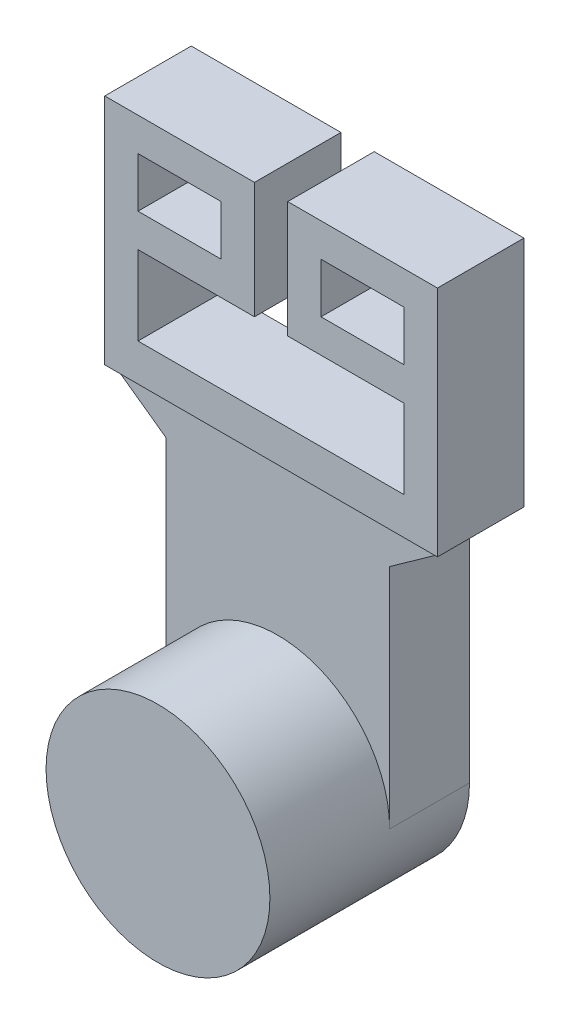
ISO-10303-21;
HEADER;
FILE_DESCRIPTION(('STEP AP214'),'2;1');
FILE_NAME('part.step','',(''),(''),'','','');
FILE_SCHEMA(('AUTOMOTIVE_DESIGN { 1 0 10303 214 1 1 1 1 }'));
ENDSEC;
DATA;
#1=APPLICATION_CONTEXT('core data for automotive mechanical design processes');
#2=APPLICATION_PROTOCOL_DEFINITION('international standard','automotive_design',2000,#1);
#3=PRODUCT_CONTEXT('',#1,'mechanical');
#4=PRODUCT('Part','Part','',(#3));
#5=PRODUCT_RELATED_PRODUCT_CATEGORY('part','',(#4));
#6=PRODUCT_DEFINITION_FORMATION('','',#4);
#7=PRODUCT_DEFINITION_CONTEXT('part definition',#1,'design');
#8=PRODUCT_DEFINITION('design','',#6,#7);
#9=PRODUCT_DEFINITION_SHAPE('','',#8);
#10=(LENGTH_UNIT() NAMED_UNIT(*) SI_UNIT(.MILLI.,.METRE.));
#11=(NAMED_UNIT(*) PLANE_ANGLE_UNIT() SI_UNIT($,.RADIAN.));
#12=(NAMED_UNIT(*) SI_UNIT($,.STERADIAN.) SOLID_ANGLE_UNIT());
#13=UNCERTAINTY_MEASURE_WITH_UNIT(LENGTH_MEASURE(1.E-05),#10,'distance_accuracy_value','');
#14=(GEOMETRIC_REPRESENTATION_CONTEXT(3) GLOBAL_UNCERTAINTY_ASSIGNED_CONTEXT((#13)) GLOBAL_UNIT_ASSIGNED_CONTEXT((#10,
#11,#12)) REPRESENTATION_CONTEXT('',''));
#15=CARTESIAN_POINT('',(0.,0.,0.));
#16=DIRECTION('',(0.,0.,1.));
#17=DIRECTION('',(1.,0.,0.));
#18=AXIS2_PLACEMENT_3D('',#15,#16,#17);
#19=CARTESIAN_POINT('',(0.,25.4,0.));
#20=DIRECTION('',(0.,1.,0.));
#21=DIRECTION('',(0.,0.,1.));
#22=AXIS2_PLACEMENT_3D('',#19,#20,#21);
#23=PLANE('',#22);
#24=DIRECTION('',(1.,0.,0.));
#25=VECTOR('',#24,1.);
#26=CARTESIAN_POINT('',(10.6807,25.4,7.62));
#27=LINE('',#26,#25);
#28=CARTESIAN_POINT('',(-15.875,25.4,7.62));
#29=VERTEX_POINT('',#28);
#30=CARTESIAN_POINT('',(15.875,25.4,7.62));
#31=VERTEX_POINT('',#30);
#32=EDGE_CURVE('E392',#29,#31,#27,.T.);
#33=ORIENTED_EDGE('',*,*,#32,.T.);
#34=DIRECTION('',(0.,0.,-1.));
#35=VECTOR('',#34,1.);
#36=CARTESIAN_POINT('',(15.875,25.4,0.));
#37=LINE('',#36,#35);
#38=CARTESIAN_POINT('',(15.875,25.4,8.255));
#39=VERTEX_POINT('',#38);
#40=EDGE_CURVE('E372',#39,#31,#37,.T.);
#41=ORIENTED_EDGE('',*,*,#40,.F.);
#42=DIRECTION('',(1.,0.,0.));
#43=VECTOR('',#42,1.);
#44=CARTESIAN_POINT('',(-15.875,25.4,8.255));
#45=LINE('',#44,#43);
#46=CARTESIAN_POINT('',(-15.875,25.4,8.255));
#47=VERTEX_POINT('',#46);
#48=EDGE_CURVE('E303',#47,#39,#45,.T.);
#49=ORIENTED_EDGE('',*,*,#48,.F.);
#50=DIRECTION('',(0.,0.,1.));
#51=VECTOR('',#50,1.);
#52=CARTESIAN_POINT('',(-15.875,25.4,15.875));
#53=LINE('',#52,#51);
#54=EDGE_CURVE('E358',#29,#47,#53,.T.);
#55=ORIENTED_EDGE('',*,*,#54,.F.);
#56=EDGE_LOOP('',(#33,#41,#49,#55));
#57=FACE_BOUND('',#56,.T.);
#58=ADVANCED_FACE('F45',(#57),#23,.F.);
#59=CARTESIAN_POINT('',(12.7,0.,0.));
#60=DIRECTION('',(1.,0.,0.));
#61=DIRECTION('',(0.,0.,-1.));
#62=AXIS2_PLACEMENT_3D('',#59,#60,#61);
#63=PLANE('',#62);
#64=DIRECTION('',(0.,0.,-1.));
#65=VECTOR('',#64,1.);
#66=CARTESIAN_POINT('',(12.7,28.956,0.));
#67=LINE('',#66,#65);
#68=CARTESIAN_POINT('',(12.7,28.956,8.255));
#69=VERTEX_POINT('',#68);
#70=CARTESIAN_POINT('',(12.7,28.956,0.));
#71=VERTEX_POINT('',#70);
#72=EDGE_CURVE('E386',#69,#71,#67,.T.);
#73=ORIENTED_EDGE('',*,*,#72,.F.);
#74=DIRECTION('',(0.,1.,0.));
#75=VECTOR('',#74,1.);
#76=CARTESIAN_POINT('',(12.7,0.,8.255));
#77=LINE('',#76,#75);
#78=CARTESIAN_POINT('',(12.7,36.5125,8.255));
#79=VERTEX_POINT('',#78);
#80=EDGE_CURVE('E313',#69,#79,#77,.T.);
#81=ORIENTED_EDGE('',*,*,#80,.T.);
#82=DIRECTION('',(0.,0.,1.));
#83=VECTOR('',#82,1.);
#84=CARTESIAN_POINT('',(12.7,36.5125,15.875));
#85=LINE('',#84,#83);
#86=CARTESIAN_POINT('',(12.7,36.5125,0.));
#87=VERTEX_POINT('',#86);
#88=EDGE_CURVE('E326',#87,#79,#85,.T.);
#89=ORIENTED_EDGE('',*,*,#88,.F.);
#90=DIRECTION('',(0.,1.,0.));
#91=VECTOR('',#90,1.);
#92=CARTESIAN_POINT('',(12.7,25.4,0.));
#93=LINE('',#92,#91);
#94=EDGE_CURVE('E365',#71,#87,#93,.T.);
#95=ORIENTED_EDGE('',*,*,#94,.F.);
#96=EDGE_LOOP('',(#73,#81,#89,#95));
#97=FACE_BOUND('',#96,.T.);
#98=ADVANCED_FACE('F467',(#97),#63,.F.);
#99=CARTESIAN_POINT('',(-12.7,0.,0.));
#100=DIRECTION('',(-1.,0.,0.));
#101=DIRECTION('',(0.,0.,1.));
#102=AXIS2_PLACEMENT_3D('',#99,#100,#101);
#103=PLANE('',#102);
#104=DIRECTION('',(0.,0.,-1.));
#105=VECTOR('',#104,1.);
#106=CARTESIAN_POINT('',(-12.7,36.5125,15.875));
#107=LINE('',#106,#105);
#108=CARTESIAN_POINT('',(-12.7,36.5125,8.255));
#109=VERTEX_POINT('',#108);
#110=CARTESIAN_POINT('',(-12.7,36.5125,0.));
#111=VERTEX_POINT('',#110);
#112=EDGE_CURVE('E339',#109,#111,#107,.T.);
#113=ORIENTED_EDGE('',*,*,#112,.F.);
#114=DIRECTION('',(0.,-1.,0.));
#115=VECTOR('',#114,1.);
#116=CARTESIAN_POINT('',(-12.7,0.,8.255));
#117=LINE('',#116,#115);
#118=CARTESIAN_POINT('',(-12.7,28.956,8.255));
#119=VERTEX_POINT('',#118);
#120=EDGE_CURVE('E318',#109,#119,#117,.T.);
#121=ORIENTED_EDGE('',*,*,#120,.T.);
#122=DIRECTION('',(0.,0.,1.));
#123=VECTOR('',#122,1.);
#124=CARTESIAN_POINT('',(-12.7,28.956,0.));
#125=LINE('',#124,#123);
#126=CARTESIAN_POINT('',(-12.7,28.956,0.));
#127=VERTEX_POINT('',#126);
#128=EDGE_CURVE('E383',#127,#119,#125,.T.);
#129=ORIENTED_EDGE('',*,*,#128,.F.);
#130=DIRECTION('',(0.,-1.,0.));
#131=VECTOR('',#130,1.);
#132=CARTESIAN_POINT('',(-12.7,25.4,0.));
#133=LINE('',#132,#131);
#134=EDGE_CURVE('E352',#111,#127,#133,.T.);
#135=ORIENTED_EDGE('',*,*,#134,.F.);
#136=EDGE_LOOP('',(#113,#121,#129,#135));
#137=FACE_BOUND('',#136,.T.);
#138=ADVANCED_FACE('F476',(#137),#103,.F.);
#139=CARTESIAN_POINT('',(0.,0.,19.05));
#140=DIRECTION('',(0.,0.,-1.));
#141=DIRECTION('',(-1.,0.,0.));
#142=AXIS2_PLACEMENT_3D('',#139,#140,#141);
#143=CYLINDRICAL_SURFACE('',#142,10.6807);
#144=CARTESIAN_POINT('',(0.,0.,7.62));
#145=DIRECTION('',(0.,0.,1.));
#146=DIRECTION('',(1.,0.,0.));
#147=AXIS2_PLACEMENT_3D('',#144,#145,#146);
#148=CIRCLE('',#147,10.6807);
#149=CARTESIAN_POINT('',(10.6807,0.,7.62));
#150=VERTEX_POINT('',#149);
#151=CARTESIAN_POINT('',(-10.6807,0.,7.62));
#152=VERTEX_POINT('',#151);
#153=EDGE_CURVE('E53',#150,#152,#148,.T.);
#154=ORIENTED_EDGE('',*,*,#153,.T.);
#155=DIRECTION('',(0.,0.,-1.));
#156=VECTOR('',#155,1.);
#157=CARTESIAN_POINT('',(-10.6807,0.,7.62));
#158=LINE('',#157,#156);
#159=CARTESIAN_POINT('',(-10.6807,0.,0.));
#160=VERTEX_POINT('',#159);
#161=EDGE_CURVE('E401',#152,#160,#158,.T.);
#162=ORIENTED_EDGE('',*,*,#161,.T.);
#163=CARTESIAN_POINT('',(0.,0.,0.));
#164=DIRECTION('',(0.,0.,1.));
#165=DIRECTION('',(1.,0.,0.));
#166=AXIS2_PLACEMENT_3D('',#163,#164,#165);
#167=CIRCLE('',#166,10.6807);
#168=CARTESIAN_POINT('',(10.6807,0.,0.));
#169=VERTEX_POINT('',#168);
#170=EDGE_CURVE('E404',#160,#169,#167,.T.);
#171=ORIENTED_EDGE('',*,*,#170,.T.);
#172=DIRECTION('',(0.,0.,-1.));
#173=VECTOR('',#172,1.);
#174=CARTESIAN_POINT('',(10.6807,0.,7.62));
#175=LINE('',#174,#173);
#176=EDGE_CURVE('E397',#150,#169,#175,.T.);
#177=ORIENTED_EDGE('',*,*,#176,.F.);
#178=EDGE_LOOP('',(#154,#162,#171,#177));
#179=FACE_BOUND('',#178,.T.);
#180=CARTESIAN_POINT('',(0.,0.,19.05));
#181=DIRECTION('',(0.,0.,1.));
#182=DIRECTION('',(1.,0.,0.));
#183=AXIS2_PLACEMENT_3D('',#180,#181,#182);
#184=CIRCLE('',#183,10.6807);
#185=CARTESIAN_POINT('',(10.6807,0.,19.05));
#186=VERTEX_POINT('',#185);
#187=EDGE_CURVE('E407',#186,#186,#184,.T.);
#188=ORIENTED_EDGE('',*,*,#187,.F.);
#189=EDGE_LOOP('',(#188));
#190=FACE_BOUND('',#189,.T.);
#191=ADVANCED_FACE('F47',(#179,#190),#143,.T.);
#192=CARTESIAN_POINT('',(0.,0.,19.05));
#193=DIRECTION('',(0.,0.,1.));
#194=DIRECTION('',(1.,0.,0.));
#195=AXIS2_PLACEMENT_3D('',#192,#193,#194);
#196=PLANE('',#195);
#197=ORIENTED_EDGE('',*,*,#187,.T.);
#198=EDGE_LOOP('',(#197));
#199=FACE_BOUND('',#198,.T.);
#200=ADVANCED_FACE('F515',(#199),#196,.T.);
#201=CARTESIAN_POINT('',(0.,0.,0.));
#202=DIRECTION('',(0.,0.,1.));
#203=DIRECTION('',(1.,0.,0.));
#204=AXIS2_PLACEMENT_3D('',#201,#202,#203);
#205=PLANE('',#204);
#206=DIRECTION('',(-1.,0.,0.));
#207=VECTOR('',#206,1.);
#208=CARTESIAN_POINT('',(12.7,39.6875,0.));
#209=LINE('',#208,#207);
#210=CARTESIAN_POINT('',(12.7,39.6875,0.));
#211=VERTEX_POINT('',#210);
#212=CARTESIAN_POINT('',(4.7625,39.6875,0.));
#213=VERTEX_POINT('',#212);
#214=EDGE_CURVE('E235',#211,#213,#209,.T.);
#215=ORIENTED_EDGE('',*,*,#214,.F.);
#216=DIRECTION('',(0.,-1.,0.));
#217=VECTOR('',#216,1.);
#218=CARTESIAN_POINT('',(12.7,39.6875,0.));
#219=LINE('',#218,#217);
#220=CARTESIAN_POINT('',(12.7,44.45,0.));
#221=VERTEX_POINT('',#220);
#222=EDGE_CURVE('E215',#221,#211,#219,.T.);
#223=ORIENTED_EDGE('',*,*,#222,.F.);
#224=DIRECTION('',(1.,0.,0.));
#225=VECTOR('',#224,1.);
#226=CARTESIAN_POINT('',(12.7,44.45,0.));
#227=LINE('',#226,#225);
#228=CARTESIAN_POINT('',(4.7625,44.45,0.));
#229=VERTEX_POINT('',#228);
#230=EDGE_CURVE('E226',#229,#221,#227,.T.);
#231=ORIENTED_EDGE('',*,*,#230,.F.);
#232=DIRECTION('',(0.,1.,0.));
#233=VECTOR('',#232,1.);
#234=CARTESIAN_POINT('',(4.7625,39.6875,0.));
#235=LINE('',#234,#233);
#236=EDGE_CURVE('E60',#213,#229,#235,.T.);
#237=ORIENTED_EDGE('',*,*,#236,.F.);
#238=EDGE_LOOP('',(#215,#223,#231,#237));
#239=FACE_BOUND('',#238,.T.);
#240=DIRECTION('',(1.,0.,0.));
#241=VECTOR('',#240,1.);
#242=CARTESIAN_POINT('',(-12.7,44.45,0.));
#243=LINE('',#242,#241);
#244=CARTESIAN_POINT('',(-12.7,44.45,0.));
#245=VERTEX_POINT('',#244);
#246=CARTESIAN_POINT('',(-4.7625,44.45,0.));
#247=VERTEX_POINT('',#246);
#248=EDGE_CURVE('E278',#245,#247,#243,.T.);
#249=ORIENTED_EDGE('',*,*,#248,.F.);
#250=DIRECTION('',(0.,1.,0.));
#251=VECTOR('',#250,1.);
#252=CARTESIAN_POINT('',(-12.7,39.6875,0.));
#253=LINE('',#252,#251);
#254=CARTESIAN_POINT('',(-12.7,39.6875,0.));
#255=VERTEX_POINT('',#254);
#256=EDGE_CURVE('E275',#255,#245,#253,.T.);
#257=ORIENTED_EDGE('',*,*,#256,.F.);
#258=DIRECTION('',(-1.,0.,0.));
#259=VECTOR('',#258,1.);
#260=CARTESIAN_POINT('',(-12.7,39.6875,0.));
#261=LINE('',#260,#259);
#262=CARTESIAN_POINT('',(-4.7625,39.6875,0.));
#263=VERTEX_POINT('',#262);
#264=EDGE_CURVE('E252',#263,#255,#261,.T.);
#265=ORIENTED_EDGE('',*,*,#264,.F.);
#266=DIRECTION('',(0.,-1.,0.));
#267=VECTOR('',#266,1.);
#268=CARTESIAN_POINT('',(-4.7625,39.6875,0.));
#269=LINE('',#268,#267);
#270=EDGE_CURVE('E68',#247,#263,#269,.T.);
#271=ORIENTED_EDGE('',*,*,#270,.F.);
#272=EDGE_LOOP('',(#249,#257,#265,#271));
#273=FACE_BOUND('',#272,.T.);
#274=DIRECTION('',(0.,1.,0.));
#275=VECTOR('',#274,1.);
#276=CARTESIAN_POINT('',(-10.6807,0.,0.));
#277=LINE('',#276,#275);
#278=CARTESIAN_POINT('',(-10.6807,21.684330035644,0.));
#279=VERTEX_POINT('',#278);
#280=EDGE_CURVE('E388',#160,#279,#277,.T.);
#281=ORIENTED_EDGE('',*,*,#280,.T.);
#282=DIRECTION('',(-0.81332923451212,0.581803709414034,0.));
#283=VECTOR('',#282,1.);
#284=CARTESIAN_POINT('',(-15.875,25.4,0.));
#285=LINE('',#284,#283);
#286=CARTESIAN_POINT('',(-15.875,25.4,0.));
#287=VERTEX_POINT('',#286);
#288=EDGE_CURVE('E288',#279,#287,#285,.T.);
#289=ORIENTED_EDGE('',*,*,#288,.T.);
#290=DIRECTION('',(0.,-1.,0.));
#291=VECTOR('',#290,1.);
#292=CARTESIAN_POINT('',(-15.875,25.4,0.));
#293=LINE('',#292,#291);
#294=CARTESIAN_POINT('',(-15.875,47.625,0.));
#295=VERTEX_POINT('',#294);
#296=EDGE_CURVE('E355',#295,#287,#293,.T.);
#297=ORIENTED_EDGE('',*,*,#296,.F.);
#298=DIRECTION('',(1.,0.,0.));
#299=VECTOR('',#298,1.);
#300=CARTESIAN_POINT('',(-15.875,47.625,0.));
#301=LINE('',#300,#299);
#302=CARTESIAN_POINT('',(-1.5875,47.625,0.));
#303=VERTEX_POINT('',#302);
#304=EDGE_CURVE('E362',#295,#303,#301,.T.);
#305=ORIENTED_EDGE('',*,*,#304,.T.);
#306=DIRECTION('',(0.,1.,0.));
#307=VECTOR('',#306,1.);
#308=CARTESIAN_POINT('',(-1.5875,36.5125,0.));
#309=LINE('',#308,#307);
#310=CARTESIAN_POINT('',(-1.5875,36.5125,0.));
#311=VERTEX_POINT('',#310);
#312=EDGE_CURVE('E345',#311,#303,#309,.T.);
#313=ORIENTED_EDGE('',*,*,#312,.F.);
#314=DIRECTION('',(-1.,0.,0.));
#315=VECTOR('',#314,1.);
#316=CARTESIAN_POINT('',(-1.5875,36.5125,0.));
#317=LINE('',#316,#315);
#318=EDGE_CURVE('E348',#311,#111,#317,.T.);
#319=ORIENTED_EDGE('',*,*,#318,.T.);
#320=ORIENTED_EDGE('',*,*,#134,.T.);
#321=DIRECTION('',(-1.,0.,0.));
#322=VECTOR('',#321,1.);
#323=CARTESIAN_POINT('',(0.,28.956,0.));
#324=LINE('',#323,#322);
#325=EDGE_CURVE('E380',#71,#127,#324,.T.);
#326=ORIENTED_EDGE('',*,*,#325,.F.);
#327=ORIENTED_EDGE('',*,*,#94,.T.);
#328=DIRECTION('',(1.,0.,0.));
#329=VECTOR('',#328,1.);
#330=CARTESIAN_POINT('',(1.5875,36.5125,0.));
#331=LINE('',#330,#329);
#332=CARTESIAN_POINT('',(1.5875,36.5125,0.));
#333=VERTEX_POINT('',#332);
#334=EDGE_CURVE('E334',#333,#87,#331,.T.);
#335=ORIENTED_EDGE('',*,*,#334,.F.);
#336=DIRECTION('',(0.,-1.,0.));
#337=VECTOR('',#336,1.);
#338=CARTESIAN_POINT('',(1.5875,36.5125,0.));
#339=LINE('',#338,#337);
#340=CARTESIAN_POINT('',(1.5875,47.625,0.));
#341=VERTEX_POINT('',#340);
#342=EDGE_CURVE('E329',#341,#333,#339,.T.);
#343=ORIENTED_EDGE('',*,*,#342,.F.);
#344=DIRECTION('',(-1.,0.,0.));
#345=VECTOR('',#344,1.);
#346=CARTESIAN_POINT('',(15.875,47.625,0.));
#347=LINE('',#346,#345);
#348=CARTESIAN_POINT('',(15.875,47.625,0.));
#349=VERTEX_POINT('',#348);
#350=EDGE_CURVE('E375',#349,#341,#347,.T.);
#351=ORIENTED_EDGE('',*,*,#350,.F.);
#352=DIRECTION('',(0.,1.,0.));
#353=VECTOR('',#352,1.);
#354=CARTESIAN_POINT('',(15.875,25.4,0.));
#355=LINE('',#354,#353);
#356=CARTESIAN_POINT('',(15.875,25.4,0.));
#357=VERTEX_POINT('',#356);
#358=EDGE_CURVE('E366',#357,#349,#355,.T.);
#359=ORIENTED_EDGE('',*,*,#358,.F.);
#360=DIRECTION('',(-0.81332923451212,-0.581803709414034,0.));
#361=VECTOR('',#360,1.);
#362=CARTESIAN_POINT('',(15.875,25.4,0.));
#363=LINE('',#362,#361);
#364=CARTESIAN_POINT('',(10.6807,21.684330035644,0.));
#365=VERTEX_POINT('',#364);
#366=EDGE_CURVE('E285',#357,#365,#363,.T.);
#367=ORIENTED_EDGE('',*,*,#366,.T.);
#368=DIRECTION('',(0.,-1.,0.));
#369=VECTOR('',#368,1.);
#370=CARTESIAN_POINT('',(10.6807,0.,0.));
#371=LINE('',#370,#369);
#372=EDGE_CURVE('E393',#365,#169,#371,.T.);
#373=ORIENTED_EDGE('',*,*,#372,.T.);
#374=ORIENTED_EDGE('',*,*,#170,.F.);
#375=EDGE_LOOP('',(#281,#289,#297,#305,#313,#319,#320,#326,#327,#335,#343,#351,#359,#367,#373,#374));
#376=FACE_BOUND('',#375,.T.);
#377=ADVANCED_FACE('F232',(#239,#273,#376),#205,.F.);
#378=CARTESIAN_POINT('',(-10.6807,0.,7.62));
#379=DIRECTION('',(-1.,0.,0.));
#380=DIRECTION('',(0.,0.,1.));
#381=AXIS2_PLACEMENT_3D('',#378,#379,#380);
#382=PLANE('',#381);
#383=DIRECTION('',(0.,0.,-1.));
#384=VECTOR('',#383,1.);
#385=CARTESIAN_POINT('',(-10.6807,21.684330035644,7.62));
#386=LINE('',#385,#384);
#387=CARTESIAN_POINT('',(-10.6807,21.684330035644,7.62));
#388=VERTEX_POINT('',#387);
#389=EDGE_CURVE('E229',#388,#279,#386,.T.);
#390=ORIENTED_EDGE('',*,*,#389,.T.);
#391=ORIENTED_EDGE('',*,*,#280,.F.);
#392=ORIENTED_EDGE('',*,*,#161,.F.);
#393=DIRECTION('',(0.,1.,0.));
#394=VECTOR('',#393,1.);
#395=CARTESIAN_POINT('',(-10.6807,0.,7.62));
#396=LINE('',#395,#394);
#397=EDGE_CURVE('E389',#152,#388,#396,.T.);
#398=ORIENTED_EDGE('',*,*,#397,.T.);
#399=EDGE_LOOP('',(#390,#391,#392,#398));
#400=FACE_BOUND('',#399,.T.);
#401=ADVANCED_FACE('F421',(#400),#382,.T.);
#402=CARTESIAN_POINT('',(10.6807,0.,7.62));
#403=DIRECTION('',(1.,0.,0.));
#404=DIRECTION('',(0.,0.,-1.));
#405=AXIS2_PLACEMENT_3D('',#402,#403,#404);
#406=PLANE('',#405);
#407=DIRECTION('',(0.,0.,-1.));
#408=VECTOR('',#407,1.);
#409=CARTESIAN_POINT('',(10.6807,21.684330035644,7.62));
#410=LINE('',#409,#408);
#411=CARTESIAN_POINT('',(10.6807,21.684330035644,7.62));
#412=VERTEX_POINT('',#411);
#413=EDGE_CURVE('E289',#412,#365,#410,.T.);
#414=ORIENTED_EDGE('',*,*,#413,.F.);
#415=DIRECTION('',(0.,-1.,0.));
#416=VECTOR('',#415,1.);
#417=CARTESIAN_POINT('',(10.6807,0.,7.62));
#418=LINE('',#417,#416);
#419=EDGE_CURVE('E395',#412,#150,#418,.T.);
#420=ORIENTED_EDGE('',*,*,#419,.T.);
#421=ORIENTED_EDGE('',*,*,#176,.T.);
#422=ORIENTED_EDGE('',*,*,#372,.F.);
#423=EDGE_LOOP('',(#414,#420,#421,#422));
#424=FACE_BOUND('',#423,.T.);
#425=ADVANCED_FACE('F443',(#424),#406,.T.);
#426=CARTESIAN_POINT('',(0.,0.,7.62));
#427=DIRECTION('',(0.,0.,1.));
#428=DIRECTION('',(1.,0.,0.));
#429=AXIS2_PLACEMENT_3D('',#426,#427,#428);
#430=PLANE('',#429);
#431=ORIENTED_EDGE('',*,*,#153,.F.);
#432=ORIENTED_EDGE('',*,*,#419,.F.);
#433=DIRECTION('',(-0.81332923451212,-0.581803709414034,0.));
#434=VECTOR('',#433,1.);
#435=CARTESIAN_POINT('',(15.875,25.4,7.62));
#436=LINE('',#435,#434);
#437=EDGE_CURVE('E282',#31,#412,#436,.T.);
#438=ORIENTED_EDGE('',*,*,#437,.F.);
#439=ORIENTED_EDGE('',*,*,#32,.F.);
#440=DIRECTION('',(-0.81332923451212,0.581803709414034,0.));
#441=VECTOR('',#440,1.);
#442=CARTESIAN_POINT('',(-15.875,25.4,7.62));
#443=LINE('',#442,#441);
#444=EDGE_CURVE('E296',#388,#29,#443,.T.);
#445=ORIENTED_EDGE('',*,*,#444,.F.);
#446=ORIENTED_EDGE('',*,*,#397,.F.);
#447=EDGE_LOOP('',(#431,#432,#438,#439,#445,#446));
#448=FACE_BOUND('',#447,.T.);
#449=ADVANCED_FACE('F423',(#448),#430,.T.);
#450=CARTESIAN_POINT('',(0.,28.956,0.));
#451=DIRECTION('',(0.,1.,0.));
#452=DIRECTION('',(0.,0.,1.));
#453=AXIS2_PLACEMENT_3D('',#450,#451,#452);
#454=PLANE('',#453);
#455=DIRECTION('',(-1.,0.,0.));
#456=VECTOR('',#455,1.);
#457=CARTESIAN_POINT('',(0.,28.956,8.255));
#458=LINE('',#457,#456);
#459=EDGE_CURVE('E316',#69,#119,#458,.T.);
#460=ORIENTED_EDGE('',*,*,#459,.F.);
#461=ORIENTED_EDGE('',*,*,#72,.T.);
#462=ORIENTED_EDGE('',*,*,#325,.T.);
#463=ORIENTED_EDGE('',*,*,#128,.T.);
#464=EDGE_LOOP('',(#460,#461,#462,#463));
#465=FACE_BOUND('',#464,.T.);
#466=ADVANCED_FACE('F473',(#465),#454,.T.);
#467=CARTESIAN_POINT('',(15.875,47.625,0.));
#468=DIRECTION('',(0.,-1.,0.));
#469=DIRECTION('',(0.,0.,-1.));
#470=AXIS2_PLACEMENT_3D('',#467,#468,#469);
#471=PLANE('',#470);
#472=DIRECTION('',(0.,0.,-1.));
#473=VECTOR('',#472,1.);
#474=CARTESIAN_POINT('',(1.5875,47.625,15.875));
#475=LINE('',#474,#473);
#476=CARTESIAN_POINT('',(1.5875,47.625,8.255));
#477=VERTEX_POINT('',#476);
#478=EDGE_CURVE('E327',#477,#341,#475,.T.);
#479=ORIENTED_EDGE('',*,*,#478,.F.);
#480=DIRECTION('',(-1.,0.,0.));
#481=VECTOR('',#480,1.);
#482=CARTESIAN_POINT('',(-15.875,47.625,8.255));
#483=LINE('',#482,#481);
#484=CARTESIAN_POINT('',(15.875,47.625,8.255));
#485=VERTEX_POINT('',#484);
#486=EDGE_CURVE('E308',#485,#477,#483,.T.);
#487=ORIENTED_EDGE('',*,*,#486,.F.);
#488=DIRECTION('',(0.,0.,1.));
#489=VECTOR('',#488,1.);
#490=CARTESIAN_POINT('',(15.875,47.625,0.));
#491=LINE('',#490,#489);
#492=EDGE_CURVE('E369',#349,#485,#491,.T.);
#493=ORIENTED_EDGE('',*,*,#492,.F.);
#494=ORIENTED_EDGE('',*,*,#350,.T.);
#495=EDGE_LOOP('',(#479,#487,#493,#494));
#496=FACE_BOUND('',#495,.T.);
#497=ADVANCED_FACE('F455',(#496),#471,.F.);
#498=CARTESIAN_POINT('',(15.875,0.,0.));
#499=DIRECTION('',(1.,0.,0.));
#500=DIRECTION('',(0.,0.,-1.));
#501=AXIS2_PLACEMENT_3D('',#498,#499,#500);
#502=PLANE('',#501);
#503=DIRECTION('',(0.,1.,0.));
#504=VECTOR('',#503,1.);
#505=CARTESIAN_POINT('',(15.875,25.4,8.255));
#506=LINE('',#505,#504);
#507=EDGE_CURVE('E305',#39,#485,#506,.T.);
#508=ORIENTED_EDGE('',*,*,#507,.F.);
#509=ORIENTED_EDGE('',*,*,#40,.T.);
#510=DIRECTION('',(0.,0.,-1.));
#511=VECTOR('',#510,1.);
#512=CARTESIAN_POINT('',(15.875,25.4,7.62));
#513=LINE('',#512,#511);
#514=EDGE_CURVE('E284',#31,#357,#513,.T.);
#515=ORIENTED_EDGE('',*,*,#514,.T.);
#516=ORIENTED_EDGE('',*,*,#358,.T.);
#517=ORIENTED_EDGE('',*,*,#492,.T.);
#518=EDGE_LOOP('',(#508,#509,#515,#516,#517));
#519=FACE_BOUND('',#518,.T.);
#520=ADVANCED_FACE('F447',(#519),#502,.T.);
#521=CARTESIAN_POINT('',(-15.875,47.625,15.875));
#522=DIRECTION('',(0.,-1.,0.));
#523=DIRECTION('',(0.,0.,-1.));
#524=AXIS2_PLACEMENT_3D('',#521,#522,#523);
#525=PLANE('',#524);
#526=DIRECTION('',(0.,0.,-1.));
#527=VECTOR('',#526,1.);
#528=CARTESIAN_POINT('',(-15.875,47.625,15.875));
#529=LINE('',#528,#527);
#530=CARTESIAN_POINT('',(-15.875,47.625,8.255));
#531=VERTEX_POINT('',#530);
#532=EDGE_CURVE('E353',#531,#295,#529,.T.);
#533=ORIENTED_EDGE('',*,*,#532,.F.);
#534=CARTESIAN_POINT('',(-1.5875,47.625,8.255));
#535=VERTEX_POINT('',#534);
#536=EDGE_CURVE('E307',#535,#531,#483,.T.);
#537=ORIENTED_EDGE('',*,*,#536,.F.);
#538=DIRECTION('',(0.,0.,1.));
#539=VECTOR('',#538,1.);
#540=CARTESIAN_POINT('',(-1.5875,47.625,0.));
#541=LINE('',#540,#539);
#542=EDGE_CURVE('E340',#303,#535,#541,.T.);
#543=ORIENTED_EDGE('',*,*,#542,.F.);
#544=ORIENTED_EDGE('',*,*,#304,.F.);
#545=EDGE_LOOP('',(#533,#537,#543,#544));
#546=FACE_BOUND('',#545,.T.);
#547=ADVANCED_FACE('F487',(#546),#525,.F.);
#548=CARTESIAN_POINT('',(-15.875,0.,0.));
#549=DIRECTION('',(-1.,0.,0.));
#550=DIRECTION('',(0.,0.,1.));
#551=AXIS2_PLACEMENT_3D('',#548,#549,#550);
#552=PLANE('',#551);
#553=DIRECTION('',(0.,-1.,0.));
#554=VECTOR('',#553,1.);
#555=CARTESIAN_POINT('',(-15.875,25.4,8.255));
#556=LINE('',#555,#554);
#557=EDGE_CURVE('E291',#531,#47,#556,.T.);
#558=ORIENTED_EDGE('',*,*,#557,.F.);
#559=ORIENTED_EDGE('',*,*,#532,.T.);
#560=ORIENTED_EDGE('',*,*,#296,.T.);
#561=EDGE_CURVE('E359',#287,#29,#53,.T.);
#562=ORIENTED_EDGE('',*,*,#561,.T.);
#563=ORIENTED_EDGE('',*,*,#54,.T.);
#564=EDGE_LOOP('',(#558,#559,#560,#562,#563));
#565=FACE_BOUND('',#564,.T.);
#566=ADVANCED_FACE('F434',(#565),#552,.T.);
#567=CARTESIAN_POINT('',(-1.5875,36.5125,15.875));
#568=DIRECTION('',(0.,1.,0.));
#569=DIRECTION('',(0.,0.,1.));
#570=AXIS2_PLACEMENT_3D('',#567,#568,#569);
#571=PLANE('',#570);
#572=DIRECTION('',(0.,0.,-1.));
#573=VECTOR('',#572,1.);
#574=CARTESIAN_POINT('',(-1.5875,36.5125,15.875));
#575=LINE('',#574,#573);
#576=CARTESIAN_POINT('',(-1.5875,36.5125,8.255));
#577=VERTEX_POINT('',#576);
#578=EDGE_CURVE('E343',#577,#311,#575,.T.);
#579=ORIENTED_EDGE('',*,*,#578,.F.);
#580=DIRECTION('',(-1.,0.,0.));
#581=VECTOR('',#580,1.);
#582=CARTESIAN_POINT('',(-1.5875,36.5125,8.255));
#583=LINE('',#582,#581);
#584=EDGE_CURVE('E321',#577,#109,#583,.T.);
#585=ORIENTED_EDGE('',*,*,#584,.T.);
#586=ORIENTED_EDGE('',*,*,#112,.T.);
#587=ORIENTED_EDGE('',*,*,#318,.F.);
#588=EDGE_LOOP('',(#579,#585,#586,#587));
#589=FACE_BOUND('',#588,.T.);
#590=ADVANCED_FACE('F480',(#589),#571,.F.);
#591=CARTESIAN_POINT('',(-1.5875,0.,0.));
#592=DIRECTION('',(1.,0.,0.));
#593=DIRECTION('',(0.,0.,-1.));
#594=AXIS2_PLACEMENT_3D('',#591,#592,#593);
#595=PLANE('',#594);
#596=DIRECTION('',(0.,1.,0.));
#597=VECTOR('',#596,1.);
#598=CARTESIAN_POINT('',(-1.5875,0.,8.255));
#599=LINE('',#598,#597);
#600=EDGE_CURVE('E324',#577,#535,#599,.T.);
#601=ORIENTED_EDGE('',*,*,#600,.F.);
#602=ORIENTED_EDGE('',*,*,#578,.T.);
#603=ORIENTED_EDGE('',*,*,#312,.T.);
#604=ORIENTED_EDGE('',*,*,#542,.T.);
#605=EDGE_LOOP('',(#601,#602,#603,#604));
#606=FACE_BOUND('',#605,.T.);
#607=ADVANCED_FACE('F484',(#606),#595,.T.);
#608=CARTESIAN_POINT('',(1.5875,36.5125,15.875));
#609=DIRECTION('',(0.,1.,0.));
#610=DIRECTION('',(-1.,0.,0.));
#611=AXIS2_PLACEMENT_3D('',#608,#609,#610);
#612=PLANE('',#611);
#613=ORIENTED_EDGE('',*,*,#88,.T.);
#614=DIRECTION('',(-1.,0.,0.));
#615=VECTOR('',#614,1.);
#616=CARTESIAN_POINT('',(1.5875,36.5125,8.255));
#617=LINE('',#616,#615);
#618=CARTESIAN_POINT('',(1.5875,36.5125,8.255));
#619=VERTEX_POINT('',#618);
#620=EDGE_CURVE('E310',#79,#619,#617,.T.);
#621=ORIENTED_EDGE('',*,*,#620,.T.);
#622=DIRECTION('',(0.,0.,1.));
#623=VECTOR('',#622,1.);
#624=CARTESIAN_POINT('',(1.5875,36.5125,15.875));
#625=LINE('',#624,#623);
#626=EDGE_CURVE('E331',#333,#619,#625,.T.);
#627=ORIENTED_EDGE('',*,*,#626,.F.);
#628=ORIENTED_EDGE('',*,*,#334,.T.);
#629=EDGE_LOOP('',(#613,#621,#627,#628));
#630=FACE_BOUND('',#629,.T.);
#631=ADVANCED_FACE('F463',(#630),#612,.F.);
#632=CARTESIAN_POINT('',(1.5875,0.,0.));
#633=DIRECTION('',(-1.,0.,0.));
#634=DIRECTION('',(0.,0.,1.));
#635=AXIS2_PLACEMENT_3D('',#632,#633,#634);
#636=PLANE('',#635);
#637=DIRECTION('',(0.,-1.,0.));
#638=VECTOR('',#637,1.);
#639=CARTESIAN_POINT('',(1.5875,0.,8.255));
#640=LINE('',#639,#638);
#641=EDGE_CURVE('E11',#477,#619,#640,.T.);
#642=ORIENTED_EDGE('',*,*,#641,.F.);
#643=ORIENTED_EDGE('',*,*,#478,.T.);
#644=ORIENTED_EDGE('',*,*,#342,.T.);
#645=ORIENTED_EDGE('',*,*,#626,.T.);
#646=EDGE_LOOP('',(#642,#643,#644,#645));
#647=FACE_BOUND('',#646,.T.);
#648=ADVANCED_FACE('F459',(#647),#636,.T.);
#649=CARTESIAN_POINT('',(0.,0.,8.255));
#650=DIRECTION('',(0.,0.,-1.));
#651=DIRECTION('',(-1.,0.,0.));
#652=AXIS2_PLACEMENT_3D('',#649,#650,#651);
#653=PLANE('',#652);
#654=DIRECTION('',(-1.,0.,0.));
#655=VECTOR('',#654,1.);
#656=CARTESIAN_POINT('',(12.7,44.45,8.255));
#657=LINE('',#656,#655);
#658=CARTESIAN_POINT('',(12.7,44.45,8.255));
#659=VERTEX_POINT('',#658);
#660=CARTESIAN_POINT('',(4.7625,44.45,8.255));
#661=VERTEX_POINT('',#660);
#662=EDGE_CURVE('E237',#659,#661,#657,.T.);
#663=ORIENTED_EDGE('',*,*,#662,.F.);
#664=DIRECTION('',(0.,1.,0.));
#665=VECTOR('',#664,1.);
#666=CARTESIAN_POINT('',(12.7,39.6875,8.255));
#667=LINE('',#666,#665);
#668=CARTESIAN_POINT('',(12.7,39.6875,8.255));
#669=VERTEX_POINT('',#668);
#670=EDGE_CURVE('E218',#669,#659,#667,.T.);
#671=ORIENTED_EDGE('',*,*,#670,.F.);
#672=DIRECTION('',(1.,0.,0.));
#673=VECTOR('',#672,1.);
#674=CARTESIAN_POINT('',(12.7,39.6875,8.255));
#675=LINE('',#674,#673);
#676=CARTESIAN_POINT('',(4.7625,39.6875,8.255));
#677=VERTEX_POINT('',#676);
#678=EDGE_CURVE('E223',#677,#669,#675,.T.);
#679=ORIENTED_EDGE('',*,*,#678,.F.);
#680=DIRECTION('',(0.,-1.,0.));
#681=VECTOR('',#680,1.);
#682=CARTESIAN_POINT('',(4.7625,39.6875,8.255));
#683=LINE('',#682,#681);
#684=EDGE_CURVE('E243',#661,#677,#683,.T.);
#685=ORIENTED_EDGE('',*,*,#684,.F.);
#686=EDGE_LOOP('',(#663,#671,#679,#685));
#687=FACE_BOUND('',#686,.T.);
#688=DIRECTION('',(1.,0.,0.));
#689=VECTOR('',#688,1.);
#690=CARTESIAN_POINT('',(-12.7,39.6875,8.255));
#691=LINE('',#690,#689);
#692=CARTESIAN_POINT('',(-12.7,39.6875,8.255));
#693=VERTEX_POINT('',#692);
#694=CARTESIAN_POINT('',(-4.7625,39.6875,8.255));
#695=VERTEX_POINT('',#694);
#696=EDGE_CURVE('E270',#693,#695,#691,.T.);
#697=ORIENTED_EDGE('',*,*,#696,.F.);
#698=DIRECTION('',(0.,-1.,0.));
#699=VECTOR('',#698,1.);
#700=CARTESIAN_POINT('',(-12.7,39.6875,8.255));
#701=LINE('',#700,#699);
#702=CARTESIAN_POINT('',(-12.7,44.45,8.255));
#703=VERTEX_POINT('',#702);
#704=EDGE_CURVE('E273',#703,#693,#701,.T.);
#705=ORIENTED_EDGE('',*,*,#704,.F.);
#706=DIRECTION('',(-1.,0.,0.));
#707=VECTOR('',#706,1.);
#708=CARTESIAN_POINT('',(-12.7,44.45,8.255));
#709=LINE('',#708,#707);
#710=CARTESIAN_POINT('',(-4.7625,44.45,8.255));
#711=VERTEX_POINT('',#710);
#712=EDGE_CURVE('E259',#711,#703,#709,.T.);
#713=ORIENTED_EDGE('',*,*,#712,.F.);
#714=DIRECTION('',(0.,1.,0.));
#715=VECTOR('',#714,1.);
#716=CARTESIAN_POINT('',(-4.7625,39.6875,8.255));
#717=LINE('',#716,#715);
#718=EDGE_CURVE('E267',#695,#711,#717,.T.);
#719=ORIENTED_EDGE('',*,*,#718,.F.);
#720=EDGE_LOOP('',(#697,#705,#713,#719));
#721=FACE_BOUND('',#720,.T.);
#722=ORIENTED_EDGE('',*,*,#600,.T.);
#723=ORIENTED_EDGE('',*,*,#536,.T.);
#724=ORIENTED_EDGE('',*,*,#557,.T.);
#725=ORIENTED_EDGE('',*,*,#48,.T.);
#726=ORIENTED_EDGE('',*,*,#507,.T.);
#727=ORIENTED_EDGE('',*,*,#486,.T.);
#728=ORIENTED_EDGE('',*,*,#641,.T.);
#729=ORIENTED_EDGE('',*,*,#620,.F.);
#730=ORIENTED_EDGE('',*,*,#80,.F.);
#731=ORIENTED_EDGE('',*,*,#459,.T.);
#732=ORIENTED_EDGE('',*,*,#120,.F.);
#733=ORIENTED_EDGE('',*,*,#584,.F.);
#734=EDGE_LOOP('',(#722,#723,#724,#725,#726,#727,#728,#729,#730,#731,#732,#733));
#735=FACE_BOUND('',#734,.T.);
#736=ADVANCED_FACE('F451',(#687,#721,#735),#653,.F.);
#737=CARTESIAN_POINT('',(-15.875,25.4,7.62));
#738=DIRECTION('',(-0.581803709414034,-0.813329234512119,0.));
#739=DIRECTION('',(0.81332923451212,-0.581803709414034,0.));
#740=AXIS2_PLACEMENT_3D('',#737,#738,#739);
#741=PLANE('',#740);
#742=ORIENTED_EDGE('',*,*,#288,.F.);
#743=ORIENTED_EDGE('',*,*,#389,.F.);
#744=ORIENTED_EDGE('',*,*,#444,.T.);
#745=ORIENTED_EDGE('',*,*,#561,.F.);
#746=EDGE_LOOP('',(#742,#743,#744,#745));
#747=FACE_BOUND('',#746,.T.);
#748=ADVANCED_FACE('F427',(#747),#741,.T.);
#749=CARTESIAN_POINT('',(15.875,25.4,7.62));
#750=DIRECTION('',(0.581803709414034,-0.813329234512119,0.));
#751=DIRECTION('',(0.81332923451212,0.581803709414034,0.));
#752=AXIS2_PLACEMENT_3D('',#749,#750,#751);
#753=PLANE('',#752);
#754=ORIENTED_EDGE('',*,*,#366,.F.);
#755=ORIENTED_EDGE('',*,*,#514,.F.);
#756=ORIENTED_EDGE('',*,*,#437,.T.);
#757=ORIENTED_EDGE('',*,*,#413,.T.);
#758=EDGE_LOOP('',(#754,#755,#756,#757));
#759=FACE_BOUND('',#758,.T.);
#760=ADVANCED_FACE('F527',(#759),#753,.T.);
#761=CARTESIAN_POINT('',(-12.7,39.6875,-0.00100000000000447));
#762=DIRECTION('',(-1.,0.,0.));
#763=DIRECTION('',(0.,0.,1.));
#764=AXIS2_PLACEMENT_3D('',#761,#762,#763);
#765=PLANE('',#764);
#766=ORIENTED_EDGE('',*,*,#256,.T.);
#767=DIRECTION('',(0.,0.,1.));
#768=VECTOR('',#767,1.);
#769=CARTESIAN_POINT('',(-12.7,44.45,-0.00100000000000447));
#770=LINE('',#769,#768);
#771=EDGE_CURVE('E255',#245,#703,#770,.T.);
#772=ORIENTED_EDGE('',*,*,#771,.T.);
#773=ORIENTED_EDGE('',*,*,#704,.T.);
#774=DIRECTION('',(0.,0.,1.));
#775=VECTOR('',#774,1.);
#776=CARTESIAN_POINT('',(-12.7,39.6875,-0.00100000000000447));
#777=LINE('',#776,#775);
#778=EDGE_CURVE('E256',#255,#693,#777,.T.);
#779=ORIENTED_EDGE('',*,*,#778,.F.);
#780=EDGE_LOOP('',(#766,#772,#773,#779));
#781=FACE_BOUND('',#780,.T.);
#782=ADVANCED_FACE('F541',(#781),#765,.F.);
#783=CARTESIAN_POINT('',(-12.7,44.45,-0.00100000000000447));
#784=DIRECTION('',(0.,1.,0.));
#785=DIRECTION('',(0.,0.,1.));
#786=AXIS2_PLACEMENT_3D('',#783,#784,#785);
#787=PLANE('',#786);
#788=ORIENTED_EDGE('',*,*,#248,.T.);
#789=DIRECTION('',(0.,0.,1.));
#790=VECTOR('',#789,1.);
#791=CARTESIAN_POINT('',(-4.7625,44.45,-0.00100000000000447));
#792=LINE('',#791,#790);
#793=EDGE_CURVE('E262',#247,#711,#792,.T.);
#794=ORIENTED_EDGE('',*,*,#793,.T.);
#795=ORIENTED_EDGE('',*,*,#712,.T.);
#796=ORIENTED_EDGE('',*,*,#771,.F.);
#797=EDGE_LOOP('',(#788,#794,#795,#796));
#798=FACE_BOUND('',#797,.T.);
#799=ADVANCED_FACE('F545',(#798),#787,.F.);
#800=CARTESIAN_POINT('',(-4.7625,39.6875,-0.00100000000000447));
#801=DIRECTION('',(1.,0.,0.));
#802=DIRECTION('',(0.,0.,-1.));
#803=AXIS2_PLACEMENT_3D('',#800,#801,#802);
#804=PLANE('',#803);
#805=ORIENTED_EDGE('',*,*,#270,.T.);
#806=DIRECTION('',(0.,0.,1.));
#807=VECTOR('',#806,1.);
#808=CARTESIAN_POINT('',(-4.7625,39.6875,-0.00100000000000447));
#809=LINE('',#808,#807);
#810=EDGE_CURVE('E260',#263,#695,#809,.T.);
#811=ORIENTED_EDGE('',*,*,#810,.T.);
#812=ORIENTED_EDGE('',*,*,#718,.T.);
#813=ORIENTED_EDGE('',*,*,#793,.F.);
#814=EDGE_LOOP('',(#805,#811,#812,#813));
#815=FACE_BOUND('',#814,.T.);
#816=ADVANCED_FACE('F554',(#815),#804,.F.);
#817=CARTESIAN_POINT('',(-12.7,39.6875,-0.00100000000000447));
#818=DIRECTION('',(0.,-1.,0.));
#819=DIRECTION('',(0.,0.,-1.));
#820=AXIS2_PLACEMENT_3D('',#817,#818,#819);
#821=PLANE('',#820);
#822=ORIENTED_EDGE('',*,*,#264,.T.);
#823=ORIENTED_EDGE('',*,*,#778,.T.);
#824=ORIENTED_EDGE('',*,*,#696,.T.);
#825=ORIENTED_EDGE('',*,*,#810,.F.);
#826=EDGE_LOOP('',(#822,#823,#824,#825));
#827=FACE_BOUND('',#826,.T.);
#828=ADVANCED_FACE('F563',(#827),#821,.F.);
#829=CARTESIAN_POINT('',(12.7,39.6875,-0.00100000000000447));
#830=DIRECTION('',(1.,0.,0.));
#831=DIRECTION('',(0.,0.,-1.));
#832=AXIS2_PLACEMENT_3D('',#829,#830,#831);
#833=PLANE('',#832);
#834=ORIENTED_EDGE('',*,*,#222,.T.);
#835=DIRECTION('',(0.,0.,1.));
#836=VECTOR('',#835,1.);
#837=CARTESIAN_POINT('',(12.7,39.6875,-0.00100000000000447));
#838=LINE('',#837,#836);
#839=EDGE_CURVE('E230',#211,#669,#838,.T.);
#840=ORIENTED_EDGE('',*,*,#839,.T.);
#841=ORIENTED_EDGE('',*,*,#670,.T.);
#842=DIRECTION('',(0.,0.,1.));
#843=VECTOR('',#842,1.);
#844=CARTESIAN_POINT('',(12.7,44.45,-0.00100000000000447));
#845=LINE('',#844,#843);
#846=EDGE_CURVE('E211',#221,#659,#845,.T.);
#847=ORIENTED_EDGE('',*,*,#846,.F.);
#848=EDGE_LOOP('',(#834,#840,#841,#847));
#849=FACE_BOUND('',#848,.T.);
#850=ADVANCED_FACE('F213',(#849),#833,.F.);
#851=CARTESIAN_POINT('',(12.7,39.6875,-0.00100000000000447));
#852=DIRECTION('',(0.,-1.,0.));
#853=DIRECTION('',(0.,0.,-1.));
#854=AXIS2_PLACEMENT_3D('',#851,#852,#853);
#855=PLANE('',#854);
#856=ORIENTED_EDGE('',*,*,#214,.T.);
#857=DIRECTION('',(0.,0.,1.));
#858=VECTOR('',#857,1.);
#859=CARTESIAN_POINT('',(4.7625,39.6875,-0.00100000000000447));
#860=LINE('',#859,#858);
#861=EDGE_CURVE('E249',#213,#677,#860,.T.);
#862=ORIENTED_EDGE('',*,*,#861,.T.);
#863=ORIENTED_EDGE('',*,*,#678,.T.);
#864=ORIENTED_EDGE('',*,*,#839,.F.);
#865=EDGE_LOOP('',(#856,#862,#863,#864));
#866=FACE_BOUND('',#865,.T.);
#867=ADVANCED_FACE('F579',(#866),#855,.F.);
#868=CARTESIAN_POINT('',(4.7625,39.6875,-0.00100000000000447));
#869=DIRECTION('',(-1.,0.,0.));
#870=DIRECTION('',(0.,0.,1.));
#871=AXIS2_PLACEMENT_3D('',#868,#869,#870);
#872=PLANE('',#871);
#873=ORIENTED_EDGE('',*,*,#236,.T.);
#874=DIRECTION('',(0.,0.,1.));
#875=VECTOR('',#874,1.);
#876=CARTESIAN_POINT('',(4.7625,44.45,-0.00100000000000447));
#877=LINE('',#876,#875);
#878=EDGE_CURVE('E222',#229,#661,#877,.T.);
#879=ORIENTED_EDGE('',*,*,#878,.T.);
#880=ORIENTED_EDGE('',*,*,#684,.T.);
#881=ORIENTED_EDGE('',*,*,#861,.F.);
#882=EDGE_LOOP('',(#873,#879,#880,#881));
#883=FACE_BOUND('',#882,.T.);
#884=ADVANCED_FACE('F587',(#883),#872,.F.);
#885=CARTESIAN_POINT('',(12.7,44.45,-0.00100000000000447));
#886=DIRECTION('',(0.,1.,0.));
#887=DIRECTION('',(0.,0.,1.));
#888=AXIS2_PLACEMENT_3D('',#885,#886,#887);
#889=PLANE('',#888);
#890=ORIENTED_EDGE('',*,*,#230,.T.);
#891=ORIENTED_EDGE('',*,*,#846,.T.);
#892=ORIENTED_EDGE('',*,*,#662,.T.);
#893=ORIENTED_EDGE('',*,*,#878,.F.);
#894=EDGE_LOOP('',(#890,#891,#892,#893));
#895=FACE_BOUND('',#894,.T.);
#896=ADVANCED_FACE('F227',(#895),#889,.F.);
#897=CLOSED_SHELL('',(#58,#98,#138,#191,#200,#377,#401,#425,#449,#466,#497,#520,#547,#566,#590,
#607,#631,#648,#736,#748,#760,#782,#799,#816,#828,#850,#867,#884,#896));
#898=MANIFOLD_SOLID_BREP('B2',#897);
#899=ADVANCED_BREP_SHAPE_REPRESENTATION('',(#18,#898),#14);
#900=SHAPE_DEFINITION_REPRESENTATION(#9,#899);
ENDSEC;
END-ISO-10303-21;
